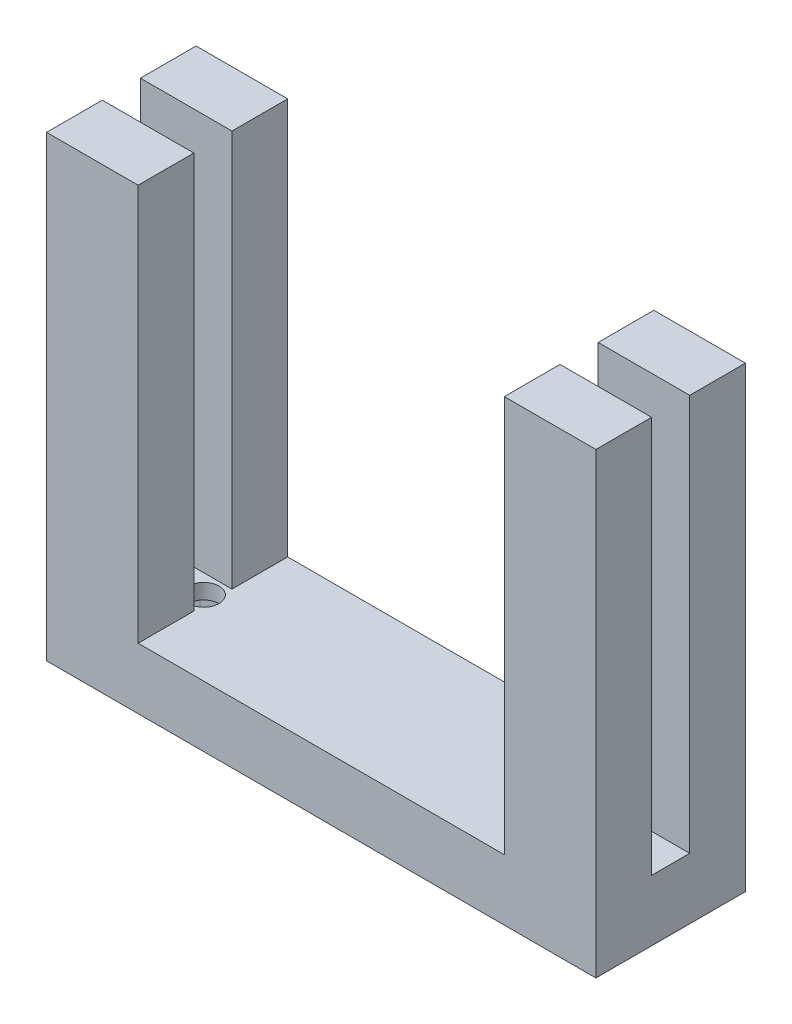
ISO-10303-21;
HEADER;
FILE_DESCRIPTION(('STEP AP214'),'2;1');
FILE_NAME('part.step','',(''),(''),'','','');
FILE_SCHEMA(('AUTOMOTIVE_DESIGN { 1 0 10303 214 1 1 1 1 }'));
ENDSEC;
DATA;
#1=APPLICATION_CONTEXT('core data for automotive mechanical design processes');
#2=APPLICATION_PROTOCOL_DEFINITION('international standard','automotive_design',2000,#1);
#3=PRODUCT_CONTEXT('',#1,'mechanical');
#4=PRODUCT('Part','Part','',(#3));
#5=PRODUCT_RELATED_PRODUCT_CATEGORY('part','',(#4));
#6=PRODUCT_DEFINITION_FORMATION('','',#4);
#7=PRODUCT_DEFINITION_CONTEXT('part definition',#1,'design');
#8=PRODUCT_DEFINITION('design','',#6,#7);
#9=PRODUCT_DEFINITION_SHAPE('','',#8);
#10=(LENGTH_UNIT() NAMED_UNIT(*) SI_UNIT(.MILLI.,.METRE.));
#11=(NAMED_UNIT(*) PLANE_ANGLE_UNIT() SI_UNIT($,.RADIAN.));
#12=(NAMED_UNIT(*) SI_UNIT($,.STERADIAN.) SOLID_ANGLE_UNIT());
#13=UNCERTAINTY_MEASURE_WITH_UNIT(LENGTH_MEASURE(1.E-05),#10,'distance_accuracy_value','');
#14=(GEOMETRIC_REPRESENTATION_CONTEXT(3) GLOBAL_UNCERTAINTY_ASSIGNED_CONTEXT((#13)) GLOBAL_UNIT_ASSIGNED_CONTEXT((#10,
#11,#12)) REPRESENTATION_CONTEXT('',''));
#15=CARTESIAN_POINT('',(0.,0.,0.));
#16=DIRECTION('',(0.,0.,1.));
#17=DIRECTION('',(1.,0.,0.));
#18=AXIS2_PLACEMENT_3D('',#15,#16,#17);
#19=CARTESIAN_POINT('',(0.,30.,0.));
#20=DIRECTION('',(0.,1.,0.));
#21=DIRECTION('',(0.,0.,1.));
#22=AXIS2_PLACEMENT_3D('',#19,#20,#21);
#23=PLANE('',#22);
#24=DIRECTION('',(0.,0.,-1.));
#25=VECTOR('',#24,1.);
#26=CARTESIAN_POINT('',(-12.,30.,4.9));
#27=LINE('',#26,#25);
#28=CARTESIAN_POINT('',(-12.,30.,-1.25));
#29=VERTEX_POINT('',#28);
#30=CARTESIAN_POINT('',(-12.,30.,-4.9));
#31=VERTEX_POINT('',#30);
#32=EDGE_CURVE('E290',#29,#31,#27,.T.);
#33=ORIENTED_EDGE('',*,*,#32,.T.);
#34=DIRECTION('',(-1.,0.,0.));
#35=VECTOR('',#34,1.);
#36=CARTESIAN_POINT('',(-18.,30.,-4.9));
#37=LINE('',#36,#35);
#38=CARTESIAN_POINT('',(-18.,30.,-4.9));
#39=VERTEX_POINT('',#38);
#40=EDGE_CURVE('E341',#31,#39,#37,.T.);
#41=ORIENTED_EDGE('',*,*,#40,.T.);
#42=DIRECTION('',(0.,0.,1.));
#43=VECTOR('',#42,1.);
#44=CARTESIAN_POINT('',(-18.,30.,-4.9));
#45=LINE('',#44,#43);
#46=CARTESIAN_POINT('',(-18.,30.,-1.25));
#47=VERTEX_POINT('',#46);
#48=EDGE_CURVE('E347',#39,#47,#45,.T.);
#49=ORIENTED_EDGE('',*,*,#48,.T.);
#50=DIRECTION('',(1.,0.,0.));
#51=VECTOR('',#50,1.);
#52=CARTESIAN_POINT('',(-18.,30.,-1.25));
#53=LINE('',#52,#51);
#54=EDGE_CURVE('E322',#47,#29,#53,.T.);
#55=ORIENTED_EDGE('',*,*,#54,.T.);
#56=EDGE_LOOP('',(#33,#41,#49,#55));
#57=FACE_BOUND('',#56,.T.);
#58=ADVANCED_FACE('F35',(#57),#23,.T.);
#59=CARTESIAN_POINT('',(-12.,30.,4.9));
#60=VERTEX_POINT('',#59);
#61=CARTESIAN_POINT('',(-12.,30.,1.25));
#62=VERTEX_POINT('',#61);
#63=EDGE_CURVE('E286',#60,#62,#27,.T.);
#64=ORIENTED_EDGE('',*,*,#63,.T.);
#65=DIRECTION('',(1.,0.,0.));
#66=VECTOR('',#65,1.);
#67=CARTESIAN_POINT('',(-18.,30.,1.25));
#68=LINE('',#67,#66);
#69=CARTESIAN_POINT('',(-18.,30.,1.25));
#70=VERTEX_POINT('',#69);
#71=EDGE_CURVE('E335',#70,#62,#68,.T.);
#72=ORIENTED_EDGE('',*,*,#71,.F.);
#73=CARTESIAN_POINT('',(-18.,30.,4.9));
#74=VERTEX_POINT('',#73);
#75=EDGE_CURVE('E346',#70,#74,#45,.T.);
#76=ORIENTED_EDGE('',*,*,#75,.T.);
#77=DIRECTION('',(1.,0.,0.));
#78=VECTOR('',#77,1.);
#79=CARTESIAN_POINT('',(-18.,30.,4.9));
#80=LINE('',#79,#78);
#81=EDGE_CURVE('E351',#74,#60,#80,.T.);
#82=ORIENTED_EDGE('',*,*,#81,.T.);
#83=EDGE_LOOP('',(#64,#72,#76,#82));
#84=FACE_BOUND('',#83,.T.);
#85=ADVANCED_FACE('F437',(#84),#23,.T.);
#86=CARTESIAN_POINT('',(-18.,30.,-1.25));
#87=DIRECTION('',(0.,0.,-1.));
#88=DIRECTION('',(0.,1.,0.));
#89=AXIS2_PLACEMENT_3D('',#86,#87,#88);
#90=PLANE('',#89);
#91=DIRECTION('',(1.,0.,0.));
#92=VECTOR('',#91,1.);
#93=CARTESIAN_POINT('',(-18.,4.,-1.25));
#94=LINE('',#93,#92);
#95=CARTESIAN_POINT('',(-18.,4.,-1.25));
#96=VERTEX_POINT('',#95);
#97=CARTESIAN_POINT('',(-12.,4.,-1.25));
#98=VERTEX_POINT('',#97);
#99=EDGE_CURVE('E327',#96,#98,#94,.T.);
#100=ORIENTED_EDGE('',*,*,#99,.T.);
#101=DIRECTION('',(0.,1.,0.));
#102=VECTOR('',#101,1.);
#103=CARTESIAN_POINT('',(-12.,30.,-1.25));
#104=LINE('',#103,#102);
#105=EDGE_CURVE('E300',#98,#29,#104,.T.);
#106=ORIENTED_EDGE('',*,*,#105,.T.);
#107=ORIENTED_EDGE('',*,*,#54,.F.);
#108=DIRECTION('',(0.,1.,0.));
#109=VECTOR('',#108,1.);
#110=CARTESIAN_POINT('',(-18.,30.,-1.25));
#111=LINE('',#110,#109);
#112=EDGE_CURVE('E311',#96,#47,#111,.T.);
#113=ORIENTED_EDGE('',*,*,#112,.F.);
#114=EDGE_LOOP('',(#100,#106,#107,#113));
#115=FACE_BOUND('',#114,.T.);
#116=ADVANCED_FACE('F425',(#115),#90,.F.);
#117=CARTESIAN_POINT('',(-18.,30.,1.25));
#118=DIRECTION('',(0.,0.,1.));
#119=DIRECTION('',(0.,-1.,0.));
#120=AXIS2_PLACEMENT_3D('',#117,#118,#119);
#121=PLANE('',#120);
#122=ORIENTED_EDGE('',*,*,#71,.T.);
#123=DIRECTION('',(0.,-1.,0.));
#124=VECTOR('',#123,1.);
#125=CARTESIAN_POINT('',(-12.,30.,1.25));
#126=LINE('',#125,#124);
#127=CARTESIAN_POINT('',(-12.,4.,1.25));
#128=VERTEX_POINT('',#127);
#129=EDGE_CURVE('E11',#62,#128,#126,.T.);
#130=ORIENTED_EDGE('',*,*,#129,.T.);
#131=DIRECTION('',(1.,0.,0.));
#132=VECTOR('',#131,1.);
#133=CARTESIAN_POINT('',(-18.,4.,1.25));
#134=LINE('',#133,#132);
#135=CARTESIAN_POINT('',(-18.,4.,1.25));
#136=VERTEX_POINT('',#135);
#137=EDGE_CURVE('E331',#136,#128,#134,.T.);
#138=ORIENTED_EDGE('',*,*,#137,.F.);
#139=DIRECTION('',(0.,-1.,0.));
#140=VECTOR('',#139,1.);
#141=CARTESIAN_POINT('',(-18.,30.,1.25));
#142=LINE('',#141,#140);
#143=EDGE_CURVE('E304',#70,#136,#142,.T.);
#144=ORIENTED_EDGE('',*,*,#143,.F.);
#145=EDGE_LOOP('',(#122,#130,#138,#144));
#146=FACE_BOUND('',#145,.T.);
#147=ADVANCED_FACE('F432',(#146),#121,.F.);
#148=DIRECTION('',(0.,0.,-1.));
#149=VECTOR('',#148,1.);
#150=CARTESIAN_POINT('',(12.,30.,4.9));
#151=LINE('',#150,#149);
#152=CARTESIAN_POINT('',(12.,30.,-1.25));
#153=VERTEX_POINT('',#152);
#154=CARTESIAN_POINT('',(12.,30.,-4.9));
#155=VERTEX_POINT('',#154);
#156=EDGE_CURVE('E280',#153,#155,#151,.T.);
#157=ORIENTED_EDGE('',*,*,#156,.F.);
#158=CARTESIAN_POINT('',(18.,30.,-1.25));
#159=VERTEX_POINT('',#158);
#160=EDGE_CURVE('E326',#153,#159,#53,.T.);
#161=ORIENTED_EDGE('',*,*,#160,.T.);
#162=DIRECTION('',(0.,0.,-1.));
#163=VECTOR('',#162,1.);
#164=CARTESIAN_POINT('',(18.,30.,-4.9));
#165=LINE('',#164,#163);
#166=CARTESIAN_POINT('',(18.,30.,-4.9));
#167=VERTEX_POINT('',#166);
#168=EDGE_CURVE('E342',#159,#167,#165,.T.);
#169=ORIENTED_EDGE('',*,*,#168,.T.);
#170=EDGE_CURVE('E343',#167,#155,#37,.T.);
#171=ORIENTED_EDGE('',*,*,#170,.T.);
#172=EDGE_LOOP('',(#157,#161,#169,#171));
#173=FACE_BOUND('',#172,.T.);
#174=ADVANCED_FACE('F414',(#173),#23,.T.);
#175=CARTESIAN_POINT('',(18.,30.,-4.9));
#176=DIRECTION('',(-1.,0.,0.));
#177=DIRECTION('',(0.,0.,1.));
#178=AXIS2_PLACEMENT_3D('',#175,#176,#177);
#179=PLANE('',#178);
#180=ORIENTED_EDGE('',*,*,#168,.F.);
#181=DIRECTION('',(0.,1.,0.));
#182=VECTOR('',#181,1.);
#183=CARTESIAN_POINT('',(18.,30.,-1.25));
#184=LINE('',#183,#182);
#185=CARTESIAN_POINT('',(18.,4.,-1.25));
#186=VERTEX_POINT('',#185);
#187=EDGE_CURVE('E308',#186,#159,#184,.T.);
#188=ORIENTED_EDGE('',*,*,#187,.F.);
#189=DIRECTION('',(0.,0.,-1.));
#190=VECTOR('',#189,1.);
#191=CARTESIAN_POINT('',(18.,4.,1.25));
#192=LINE('',#191,#190);
#193=CARTESIAN_POINT('',(18.,4.,1.25));
#194=VERTEX_POINT('',#193);
#195=EDGE_CURVE('E317',#194,#186,#192,.T.);
#196=ORIENTED_EDGE('',*,*,#195,.F.);
#197=DIRECTION('',(0.,-1.,0.));
#198=VECTOR('',#197,1.);
#199=CARTESIAN_POINT('',(18.,30.,1.25));
#200=LINE('',#199,#198);
#201=CARTESIAN_POINT('',(18.,30.,1.25));
#202=VERTEX_POINT('',#201);
#203=EDGE_CURVE('E303',#202,#194,#200,.T.);
#204=ORIENTED_EDGE('',*,*,#203,.F.);
#205=CARTESIAN_POINT('',(18.,30.,4.9));
#206=VERTEX_POINT('',#205);
#207=EDGE_CURVE('E338',#206,#202,#165,.T.);
#208=ORIENTED_EDGE('',*,*,#207,.F.);
#209=DIRECTION('',(0.,-1.,0.));
#210=VECTOR('',#209,1.);
#211=CARTESIAN_POINT('',(18.,30.,4.9));
#212=LINE('',#211,#210);
#213=CARTESIAN_POINT('',(18.,0.,4.9));
#214=VERTEX_POINT('',#213);
#215=EDGE_CURVE('E354',#206,#214,#212,.T.);
#216=ORIENTED_EDGE('',*,*,#215,.T.);
#217=DIRECTION('',(0.,0.,-1.));
#218=VECTOR('',#217,1.);
#219=CARTESIAN_POINT('',(18.,0.,-4.9));
#220=LINE('',#219,#218);
#221=CARTESIAN_POINT('',(18.,0.,-4.9));
#222=VERTEX_POINT('',#221);
#223=EDGE_CURVE('E325',#214,#222,#220,.T.);
#224=ORIENTED_EDGE('',*,*,#223,.T.);
#225=DIRECTION('',(0.,-1.,0.));
#226=VECTOR('',#225,1.);
#227=CARTESIAN_POINT('',(18.,30.,-4.9));
#228=LINE('',#227,#226);
#229=EDGE_CURVE('E371',#167,#222,#228,.T.);
#230=ORIENTED_EDGE('',*,*,#229,.F.);
#231=EDGE_LOOP('',(#180,#188,#196,#204,#208,#216,#224,#230));
#232=FACE_BOUND('',#231,.T.);
#233=ADVANCED_FACE('F37',(#232),#179,.F.);
#234=CARTESIAN_POINT('',(-18.,30.,-4.9));
#235=DIRECTION('',(0.,0.,1.));
#236=DIRECTION('',(1.,0.,0.));
#237=AXIS2_PLACEMENT_3D('',#234,#235,#236);
#238=PLANE('',#237);
#239=ORIENTED_EDGE('',*,*,#40,.F.);
#240=DIRECTION('',(0.,1.,0.));
#241=VECTOR('',#240,1.);
#242=CARTESIAN_POINT('',(-12.,30.,-4.9));
#243=LINE('',#242,#241);
#244=CARTESIAN_POINT('',(-12.,4.,-4.9));
#245=VERTEX_POINT('',#244);
#246=EDGE_CURVE('E274',#245,#31,#243,.T.);
#247=ORIENTED_EDGE('',*,*,#246,.F.);
#248=DIRECTION('',(-1.,0.,0.));
#249=VECTOR('',#248,1.);
#250=CARTESIAN_POINT('',(12.,4.,-4.9));
#251=LINE('',#250,#249);
#252=CARTESIAN_POINT('',(12.,4.,-4.9));
#253=VERTEX_POINT('',#252);
#254=EDGE_CURVE('E282',#253,#245,#251,.T.);
#255=ORIENTED_EDGE('',*,*,#254,.F.);
#256=DIRECTION('',(0.,-1.,0.));
#257=VECTOR('',#256,1.);
#258=CARTESIAN_POINT('',(12.,30.,-4.9));
#259=LINE('',#258,#257);
#260=EDGE_CURVE('E258',#155,#253,#259,.T.);
#261=ORIENTED_EDGE('',*,*,#260,.F.);
#262=ORIENTED_EDGE('',*,*,#170,.F.);
#263=ORIENTED_EDGE('',*,*,#229,.T.);
#264=DIRECTION('',(-1.,0.,0.));
#265=VECTOR('',#264,1.);
#266=CARTESIAN_POINT('',(-18.,0.,-4.9));
#267=LINE('',#266,#265);
#268=CARTESIAN_POINT('',(-18.,0.,-4.9));
#269=VERTEX_POINT('',#268);
#270=EDGE_CURVE('E357',#222,#269,#267,.T.);
#271=ORIENTED_EDGE('',*,*,#270,.T.);
#272=DIRECTION('',(0.,-1.,0.));
#273=VECTOR('',#272,1.);
#274=CARTESIAN_POINT('',(-18.,30.,-4.9));
#275=LINE('',#274,#273);
#276=EDGE_CURVE('E368',#39,#269,#275,.T.);
#277=ORIENTED_EDGE('',*,*,#276,.F.);
#278=EDGE_LOOP('',(#239,#247,#255,#261,#262,#263,#271,#277));
#279=FACE_BOUND('',#278,.T.);
#280=ADVANCED_FACE('F408',(#279),#238,.F.);
#281=CARTESIAN_POINT('',(-18.,30.,-4.9));
#282=DIRECTION('',(1.,0.,0.));
#283=DIRECTION('',(0.,0.,-1.));
#284=AXIS2_PLACEMENT_3D('',#281,#282,#283);
#285=PLANE('',#284);
#286=DIRECTION('',(0.,0.,-1.));
#287=VECTOR('',#286,1.);
#288=CARTESIAN_POINT('',(-18.,4.,1.25));
#289=LINE('',#288,#287);
#290=EDGE_CURVE('E307',#136,#96,#289,.T.);
#291=ORIENTED_EDGE('',*,*,#290,.T.);
#292=ORIENTED_EDGE('',*,*,#112,.T.);
#293=ORIENTED_EDGE('',*,*,#48,.F.);
#294=ORIENTED_EDGE('',*,*,#276,.T.);
#295=DIRECTION('',(0.,0.,1.));
#296=VECTOR('',#295,1.);
#297=CARTESIAN_POINT('',(-18.,0.,-4.9));
#298=LINE('',#297,#296);
#299=CARTESIAN_POINT('',(-18.,0.,4.9));
#300=VERTEX_POINT('',#299);
#301=EDGE_CURVE('E359',#269,#300,#298,.T.);
#302=ORIENTED_EDGE('',*,*,#301,.T.);
#303=DIRECTION('',(0.,-1.,0.));
#304=VECTOR('',#303,1.);
#305=CARTESIAN_POINT('',(-18.,30.,4.9));
#306=LINE('',#305,#304);
#307=EDGE_CURVE('E365',#74,#300,#306,.T.);
#308=ORIENTED_EDGE('',*,*,#307,.F.);
#309=ORIENTED_EDGE('',*,*,#75,.F.);
#310=ORIENTED_EDGE('',*,*,#143,.T.);
#311=EDGE_LOOP('',(#291,#292,#293,#294,#302,#308,#309,#310));
#312=FACE_BOUND('',#311,.T.);
#313=ADVANCED_FACE('F428',(#312),#285,.F.);
#314=CARTESIAN_POINT('',(-18.,30.,4.9));
#315=DIRECTION('',(0.,0.,-1.));
#316=DIRECTION('',(-1.,0.,0.));
#317=AXIS2_PLACEMENT_3D('',#314,#315,#316);
#318=PLANE('',#317);
#319=DIRECTION('',(-1.,0.,0.));
#320=VECTOR('',#319,1.);
#321=CARTESIAN_POINT('',(12.,4.,4.9));
#322=LINE('',#321,#320);
#323=CARTESIAN_POINT('',(12.,4.,4.9));
#324=VERTEX_POINT('',#323);
#325=CARTESIAN_POINT('',(-12.,4.,4.9));
#326=VERTEX_POINT('',#325);
#327=EDGE_CURVE('E273',#324,#326,#322,.T.);
#328=ORIENTED_EDGE('',*,*,#327,.T.);
#329=DIRECTION('',(0.,1.,0.));
#330=VECTOR('',#329,1.);
#331=CARTESIAN_POINT('',(-12.,30.,4.9));
#332=LINE('',#331,#330);
#333=EDGE_CURVE('E277',#326,#60,#332,.T.);
#334=ORIENTED_EDGE('',*,*,#333,.T.);
#335=ORIENTED_EDGE('',*,*,#81,.F.);
#336=ORIENTED_EDGE('',*,*,#307,.T.);
#337=DIRECTION('',(1.,0.,0.));
#338=VECTOR('',#337,1.);
#339=CARTESIAN_POINT('',(-18.,0.,4.9));
#340=LINE('',#339,#338);
#341=EDGE_CURVE('E361',#300,#214,#340,.T.);
#342=ORIENTED_EDGE('',*,*,#341,.T.);
#343=ORIENTED_EDGE('',*,*,#215,.F.);
#344=CARTESIAN_POINT('',(12.,30.,4.9));
#345=VERTEX_POINT('',#344);
#346=EDGE_CURVE('E350',#345,#206,#80,.T.);
#347=ORIENTED_EDGE('',*,*,#346,.F.);
#348=DIRECTION('',(0.,-1.,0.));
#349=VECTOR('',#348,1.);
#350=CARTESIAN_POINT('',(12.,30.,4.9));
#351=LINE('',#350,#349);
#352=EDGE_CURVE('E270',#345,#324,#351,.T.);
#353=ORIENTED_EDGE('',*,*,#352,.T.);
#354=EDGE_LOOP('',(#328,#334,#335,#336,#342,#343,#347,#353));
#355=FACE_BOUND('',#354,.T.);
#356=ADVANCED_FACE('F397',(#355),#318,.F.);
#357=CARTESIAN_POINT('',(12.,30.,1.25));
#358=VERTEX_POINT('',#357);
#359=EDGE_CURVE('E297',#345,#358,#151,.T.);
#360=ORIENTED_EDGE('',*,*,#359,.F.);
#361=ORIENTED_EDGE('',*,*,#346,.T.);
#362=ORIENTED_EDGE('',*,*,#207,.T.);
#363=EDGE_CURVE('E314',#358,#202,#68,.T.);
#364=ORIENTED_EDGE('',*,*,#363,.F.);
#365=EDGE_LOOP('',(#360,#361,#362,#364));
#366=FACE_BOUND('',#365,.T.);
#367=ADVANCED_FACE('F382',(#366),#23,.T.);
#368=CARTESIAN_POINT('',(0.,0.,0.));
#369=DIRECTION('',(0.,1.,0.));
#370=DIRECTION('',(0.,0.,1.));
#371=AXIS2_PLACEMENT_3D('',#368,#369,#370);
#372=PLANE('',#371);
#373=DIRECTION('',(-0.994815633276555,0.,0.101694915254237));
#374=VECTOR('',#373,1.);
#375=CARTESIAN_POINT('',(14.9661016949153,0.,2.11398322071268));
#376=LINE('',#375,#374);
#377=CARTESIAN_POINT('',(14.9661016949153,0.,2.11398322071268));
#378=VERTEX_POINT('',#377);
#379=CARTESIAN_POINT('',(0.368644067796609,0.,3.60620667062751));
#380=VERTEX_POINT('',#379);
#381=EDGE_CURVE('E240',#378,#380,#376,.T.);
#382=ORIENTED_EDGE('',*,*,#381,.F.);
#383=CARTESIAN_POINT('',(14.75,0.,0.));
#384=DIRECTION('',(0.,-1.,0.));
#385=DIRECTION('',(0.,0.,-1.));
#386=AXIS2_PLACEMENT_3D('',#383,#384,#385);
#387=CIRCLE('',#386,2.125);
#388=CARTESIAN_POINT('',(14.9661016949153,0.,-2.11398322071268));
#389=VERTEX_POINT('',#388);
#390=EDGE_CURVE('E50',#389,#378,#387,.T.);
#391=ORIENTED_EDGE('',*,*,#390,.F.);
#392=DIRECTION('',(0.994815633276555,0.,0.101694915254237));
#393=VECTOR('',#392,1.);
#394=CARTESIAN_POINT('',(14.9661016949153,0.,-2.11398322071268));
#395=LINE('',#394,#393);
#396=CARTESIAN_POINT('',(0.368644067796609,0.,-3.60620667062751));
#397=VERTEX_POINT('',#396);
#398=EDGE_CURVE('E217',#397,#389,#395,.T.);
#399=ORIENTED_EDGE('',*,*,#398,.F.);
#400=CARTESIAN_POINT('',(0.,0.,0.));
#401=DIRECTION('',(0.,-1.,0.));
#402=DIRECTION('',(0.,0.,-1.));
#403=AXIS2_PLACEMENT_3D('',#400,#401,#402);
#404=CIRCLE('',#403,3.625);
#405=CARTESIAN_POINT('',(-0.36864406779661,0.,-3.60620667062751));
#406=VERTEX_POINT('',#405);
#407=EDGE_CURVE('E220',#406,#397,#404,.T.);
#408=ORIENTED_EDGE('',*,*,#407,.F.);
#409=DIRECTION('',(0.994815633276555,0.,-0.101694915254237));
#410=VECTOR('',#409,1.);
#411=CARTESIAN_POINT('',(-14.9661016949153,0.,-2.11398322071268));
#412=LINE('',#411,#410);
#413=CARTESIAN_POINT('',(-14.9661016949153,0.,-2.11398322071268));
#414=VERTEX_POINT('',#413);
#415=EDGE_CURVE('E251',#414,#406,#412,.T.);
#416=ORIENTED_EDGE('',*,*,#415,.F.);
#417=CARTESIAN_POINT('',(-14.75,0.,0.));
#418=DIRECTION('',(0.,-1.,0.));
#419=DIRECTION('',(0.,0.,1.));
#420=AXIS2_PLACEMENT_3D('',#417,#418,#419);
#421=CIRCLE('',#420,2.125);
#422=CARTESIAN_POINT('',(-14.9661016949153,0.,2.11398322071268));
#423=VERTEX_POINT('',#422);
#424=EDGE_CURVE('E248',#423,#414,#421,.T.);
#425=ORIENTED_EDGE('',*,*,#424,.F.);
#426=DIRECTION('',(-0.994815633276555,0.,-0.101694915254237));
#427=VECTOR('',#426,1.);
#428=CARTESIAN_POINT('',(-0.368644067796609,0.,3.60620667062751));
#429=LINE('',#428,#427);
#430=CARTESIAN_POINT('',(-0.368644067796608,0.,3.60620667062751));
#431=VERTEX_POINT('',#430);
#432=EDGE_CURVE('E245',#431,#423,#429,.T.);
#433=ORIENTED_EDGE('',*,*,#432,.F.);
#434=CARTESIAN_POINT('',(0.,0.,0.));
#435=DIRECTION('',(0.,-1.,0.));
#436=DIRECTION('',(0.,0.,-1.));
#437=AXIS2_PLACEMENT_3D('',#434,#435,#436);
#438=CIRCLE('',#437,3.625);
#439=EDGE_CURVE('E242',#380,#431,#438,.T.);
#440=ORIENTED_EDGE('',*,*,#439,.F.);
#441=EDGE_LOOP('',(#382,#391,#399,#408,#416,#425,#433,#440));
#442=FACE_BOUND('',#441,.T.);
#443=ORIENTED_EDGE('',*,*,#223,.F.);
#444=ORIENTED_EDGE('',*,*,#341,.F.);
#445=ORIENTED_EDGE('',*,*,#301,.F.);
#446=ORIENTED_EDGE('',*,*,#270,.F.);
#447=EDGE_LOOP('',(#443,#444,#445,#446));
#448=FACE_BOUND('',#447,.T.);
#449=ADVANCED_FACE('F403',(#442,#448),#372,.F.);
#450=ORIENTED_EDGE('',*,*,#160,.F.);
#451=DIRECTION('',(0.,-1.,0.));
#452=VECTOR('',#451,1.);
#453=CARTESIAN_POINT('',(12.,30.,-1.25));
#454=LINE('',#453,#452);
#455=CARTESIAN_POINT('',(12.,4.,-1.25));
#456=VERTEX_POINT('',#455);
#457=EDGE_CURVE('E289',#153,#456,#454,.T.);
#458=ORIENTED_EDGE('',*,*,#457,.T.);
#459=EDGE_CURVE('E330',#456,#186,#94,.T.);
#460=ORIENTED_EDGE('',*,*,#459,.T.);
#461=ORIENTED_EDGE('',*,*,#187,.T.);
#462=EDGE_LOOP('',(#450,#458,#460,#461));
#463=FACE_BOUND('',#462,.T.);
#464=ADVANCED_FACE('F417',(#463),#90,.F.);
#465=CARTESIAN_POINT('',(-18.,4.,1.25));
#466=DIRECTION('',(0.,-1.,0.));
#467=DIRECTION('',(0.,0.,-1.));
#468=AXIS2_PLACEMENT_3D('',#465,#466,#467);
#469=PLANE('',#468);
#470=CARTESIAN_POINT('',(-12.6,4.,0.));
#471=DIRECTION('',(0.,-1.,0.));
#472=DIRECTION('',(0.,0.,-1.));
#473=AXIS2_PLACEMENT_3D('',#470,#471,#472);
#474=CIRCLE('',#473,1.);
#475=CARTESIAN_POINT('',(-12.6,4.,-0.999999999999999));
#476=VERTEX_POINT('',#475);
#477=EDGE_CURVE('E485',#476,#476,#474,.F.);
#478=ORIENTED_EDGE('',*,*,#477,.F.);
#479=EDGE_LOOP('',(#478));
#480=FACE_BOUND('',#479,.T.);
#481=CARTESIAN_POINT('',(12.6,4.,0.));
#482=DIRECTION('',(0.,-1.,0.));
#483=DIRECTION('',(0.,0.,-1.));
#484=AXIS2_PLACEMENT_3D('',#481,#482,#483);
#485=CIRCLE('',#484,1.);
#486=CARTESIAN_POINT('',(12.6,4.,-1.));
#487=VERTEX_POINT('',#486);
#488=EDGE_CURVE('E223',#487,#487,#485,.F.);
#489=ORIENTED_EDGE('',*,*,#488,.F.);
#490=EDGE_LOOP('',(#489));
#491=FACE_BOUND('',#490,.T.);
#492=ORIENTED_EDGE('',*,*,#459,.F.);
#493=DIRECTION('',(0.,0.,-1.));
#494=VECTOR('',#493,1.);
#495=CARTESIAN_POINT('',(12.,4.,4.9));
#496=LINE('',#495,#494);
#497=EDGE_CURVE('E58',#456,#253,#496,.T.);
#498=ORIENTED_EDGE('',*,*,#497,.T.);
#499=ORIENTED_EDGE('',*,*,#254,.T.);
#500=DIRECTION('',(0.,0.,-1.));
#501=VECTOR('',#500,1.);
#502=CARTESIAN_POINT('',(-12.,4.,4.9));
#503=LINE('',#502,#501);
#504=EDGE_CURVE('E293',#98,#245,#503,.T.);
#505=ORIENTED_EDGE('',*,*,#504,.F.);
#506=ORIENTED_EDGE('',*,*,#99,.F.);
#507=ORIENTED_EDGE('',*,*,#290,.F.);
#508=ORIENTED_EDGE('',*,*,#137,.T.);
#509=EDGE_CURVE('E291',#326,#128,#503,.T.);
#510=ORIENTED_EDGE('',*,*,#509,.F.);
#511=ORIENTED_EDGE('',*,*,#327,.F.);
#512=CARTESIAN_POINT('',(12.,4.,1.25));
#513=VERTEX_POINT('',#512);
#514=EDGE_CURVE('E294',#324,#513,#496,.T.);
#515=ORIENTED_EDGE('',*,*,#514,.T.);
#516=EDGE_CURVE('E334',#513,#194,#134,.T.);
#517=ORIENTED_EDGE('',*,*,#516,.T.);
#518=ORIENTED_EDGE('',*,*,#195,.T.);
#519=EDGE_LOOP('',(#492,#498,#499,#505,#506,#507,#508,#510,#511,#515,#517,#518));
#520=FACE_BOUND('',#519,.T.);
#521=ADVANCED_FACE('F393',(#480,#491,#520),#469,.F.);
#522=ORIENTED_EDGE('',*,*,#516,.F.);
#523=DIRECTION('',(0.,1.,0.));
#524=VECTOR('',#523,1.);
#525=CARTESIAN_POINT('',(12.,30.,1.25));
#526=LINE('',#525,#524);
#527=EDGE_CURVE('E43',#513,#358,#526,.T.);
#528=ORIENTED_EDGE('',*,*,#527,.T.);
#529=ORIENTED_EDGE('',*,*,#363,.T.);
#530=ORIENTED_EDGE('',*,*,#203,.T.);
#531=EDGE_LOOP('',(#522,#528,#529,#530));
#532=FACE_BOUND('',#531,.T.);
#533=ADVANCED_FACE('F377',(#532),#121,.F.);
#534=CARTESIAN_POINT('',(12.,30.,4.9));
#535=DIRECTION('',(1.,0.,0.));
#536=DIRECTION('',(0.,1.,0.));
#537=AXIS2_PLACEMENT_3D('',#534,#535,#536);
#538=PLANE('',#537);
#539=ORIENTED_EDGE('',*,*,#514,.F.);
#540=ORIENTED_EDGE('',*,*,#352,.F.);
#541=ORIENTED_EDGE('',*,*,#359,.T.);
#542=ORIENTED_EDGE('',*,*,#527,.F.);
#543=EDGE_LOOP('',(#539,#540,#541,#542));
#544=FACE_BOUND('',#543,.T.);
#545=ADVANCED_FACE('F395',(#544),#538,.F.);
#546=CARTESIAN_POINT('',(-12.,30.,4.9));
#547=DIRECTION('',(-1.,0.,0.));
#548=DIRECTION('',(0.,-1.,0.));
#549=AXIS2_PLACEMENT_3D('',#546,#547,#548);
#550=PLANE('',#549);
#551=ORIENTED_EDGE('',*,*,#63,.F.);
#552=ORIENTED_EDGE('',*,*,#333,.F.);
#553=ORIENTED_EDGE('',*,*,#509,.T.);
#554=ORIENTED_EDGE('',*,*,#129,.F.);
#555=EDGE_LOOP('',(#551,#552,#553,#554));
#556=FACE_BOUND('',#555,.T.);
#557=ADVANCED_FACE('F435',(#556),#550,.F.);
#558=ORIENTED_EDGE('',*,*,#504,.T.);
#559=ORIENTED_EDGE('',*,*,#246,.T.);
#560=ORIENTED_EDGE('',*,*,#32,.F.);
#561=ORIENTED_EDGE('',*,*,#105,.F.);
#562=EDGE_LOOP('',(#558,#559,#560,#561));
#563=FACE_BOUND('',#562,.T.);
#564=ADVANCED_FACE('F440',(#563),#550,.F.);
#565=ORIENTED_EDGE('',*,*,#156,.T.);
#566=ORIENTED_EDGE('',*,*,#260,.T.);
#567=ORIENTED_EDGE('',*,*,#497,.F.);
#568=ORIENTED_EDGE('',*,*,#457,.F.);
#569=EDGE_LOOP('',(#565,#566,#567,#568));
#570=FACE_BOUND('',#569,.T.);
#571=ADVANCED_FACE('F418',(#570),#538,.F.);
#572=CARTESIAN_POINT('',(14.75,3.,0.));
#573=DIRECTION('',(0.,-1.,0.));
#574=DIRECTION('',(0.,0.,-1.));
#575=AXIS2_PLACEMENT_3D('',#572,#573,#574);
#576=CYLINDRICAL_SURFACE('',#575,2.125);
#577=ORIENTED_EDGE('',*,*,#390,.T.);
#578=DIRECTION('',(0.,-1.,0.));
#579=VECTOR('',#578,1.);
#580=CARTESIAN_POINT('',(14.9661016949153,3.,2.11398322071268));
#581=LINE('',#580,#579);
#582=CARTESIAN_POINT('',(14.9661016949153,3.,2.11398322071268));
#583=VERTEX_POINT('',#582);
#584=EDGE_CURVE('E194',#583,#378,#581,.T.);
#585=ORIENTED_EDGE('',*,*,#584,.F.);
#586=CARTESIAN_POINT('',(14.75,3.,0.));
#587=DIRECTION('',(0.,-1.,0.));
#588=DIRECTION('',(0.,0.,-1.));
#589=AXIS2_PLACEMENT_3D('',#586,#587,#588);
#590=CIRCLE('',#589,2.125);
#591=CARTESIAN_POINT('',(14.9661016949153,3.,-2.11398322071268));
#592=VERTEX_POINT('',#591);
#593=EDGE_CURVE('E198',#592,#583,#590,.T.);
#594=ORIENTED_EDGE('',*,*,#593,.F.);
#595=DIRECTION('',(0.,-1.,0.));
#596=VECTOR('',#595,1.);
#597=CARTESIAN_POINT('',(14.9661016949153,3.,-2.11398322071268));
#598=LINE('',#597,#596);
#599=EDGE_CURVE('E256',#592,#389,#598,.T.);
#600=ORIENTED_EDGE('',*,*,#599,.T.);
#601=EDGE_LOOP('',(#577,#585,#594,#600));
#602=FACE_BOUND('',#601,.T.);
#603=ADVANCED_FACE('F196',(#602),#576,.F.);
#604=CARTESIAN_POINT('',(14.9661016949153,3.,-2.11398322071268));
#605=DIRECTION('',(0.101694915254237,0.,-0.994815633276555));
#606=DIRECTION('',(-0.994815633276555,0.,-0.101694915254237));
#607=AXIS2_PLACEMENT_3D('',#604,#605,#606);
#608=PLANE('',#607);
#609=ORIENTED_EDGE('',*,*,#398,.T.);
#610=ORIENTED_EDGE('',*,*,#599,.F.);
#611=DIRECTION('',(0.994815633276555,0.,0.101694915254237));
#612=VECTOR('',#611,1.);
#613=CARTESIAN_POINT('',(14.9661016949153,3.,-2.11398322071268));
#614=LINE('',#613,#612);
#615=CARTESIAN_POINT('',(0.368644067796609,3.,-3.60620667062751));
#616=VERTEX_POINT('',#615);
#617=EDGE_CURVE('E204',#616,#592,#614,.T.);
#618=ORIENTED_EDGE('',*,*,#617,.F.);
#619=DIRECTION('',(0.,-1.,0.));
#620=VECTOR('',#619,1.);
#621=CARTESIAN_POINT('',(0.368644067796609,3.,-3.60620667062751));
#622=LINE('',#621,#620);
#623=EDGE_CURVE('E259',#616,#397,#622,.T.);
#624=ORIENTED_EDGE('',*,*,#623,.T.);
#625=EDGE_LOOP('',(#609,#610,#618,#624));
#626=FACE_BOUND('',#625,.T.);
#627=ADVANCED_FACE('F515',(#626),#608,.F.);
#628=CARTESIAN_POINT('',(0.,3.,0.));
#629=DIRECTION('',(0.,-1.,0.));
#630=DIRECTION('',(0.,0.,-1.));
#631=AXIS2_PLACEMENT_3D('',#628,#629,#630);
#632=CYLINDRICAL_SURFACE('',#631,3.625);
#633=ORIENTED_EDGE('',*,*,#407,.T.);
#634=ORIENTED_EDGE('',*,*,#623,.F.);
#635=CARTESIAN_POINT('',(0.,3.,0.));
#636=DIRECTION('',(0.,-1.,0.));
#637=DIRECTION('',(0.,0.,-1.));
#638=AXIS2_PLACEMENT_3D('',#635,#636,#637);
#639=CIRCLE('',#638,3.625);
#640=CARTESIAN_POINT('',(-0.36864406779661,3.,-3.60620667062751));
#641=VERTEX_POINT('',#640);
#642=EDGE_CURVE('E236',#641,#616,#639,.T.);
#643=ORIENTED_EDGE('',*,*,#642,.F.);
#644=DIRECTION('',(0.,-1.,0.));
#645=VECTOR('',#644,1.);
#646=CARTESIAN_POINT('',(-0.36864406779661,3.,-3.60620667062751));
#647=LINE('',#646,#645);
#648=EDGE_CURVE('E261',#641,#406,#647,.T.);
#649=ORIENTED_EDGE('',*,*,#648,.T.);
#650=EDGE_LOOP('',(#633,#634,#643,#649));
#651=FACE_BOUND('',#650,.T.);
#652=ADVANCED_FACE('F518',(#651),#632,.F.);
#653=CARTESIAN_POINT('',(-14.9661016949153,3.,-2.11398322071268));
#654=DIRECTION('',(-0.101694915254237,0.,-0.994815633276555));
#655=DIRECTION('',(-0.994815633276555,0.,0.101694915254237));
#656=AXIS2_PLACEMENT_3D('',#653,#654,#655);
#657=PLANE('',#656);
#658=ORIENTED_EDGE('',*,*,#415,.T.);
#659=ORIENTED_EDGE('',*,*,#648,.F.);
#660=DIRECTION('',(0.994815633276555,0.,-0.101694915254237));
#661=VECTOR('',#660,1.);
#662=CARTESIAN_POINT('',(-14.9661016949153,3.,-2.11398322071268));
#663=LINE('',#662,#661);
#664=CARTESIAN_POINT('',(-14.9661016949153,3.,-2.11398322071268));
#665=VERTEX_POINT('',#664);
#666=EDGE_CURVE('E233',#665,#641,#663,.T.);
#667=ORIENTED_EDGE('',*,*,#666,.F.);
#668=DIRECTION('',(0.,-1.,0.));
#669=VECTOR('',#668,1.);
#670=CARTESIAN_POINT('',(-14.9661016949153,3.,-2.11398322071268));
#671=LINE('',#670,#669);
#672=EDGE_CURVE('E263',#665,#414,#671,.T.);
#673=ORIENTED_EDGE('',*,*,#672,.T.);
#674=EDGE_LOOP('',(#658,#659,#667,#673));
#675=FACE_BOUND('',#674,.T.);
#676=ADVANCED_FACE('F522',(#675),#657,.F.);
#677=CARTESIAN_POINT('',(-14.75,3.,0.));
#678=DIRECTION('',(0.,-1.,0.));
#679=DIRECTION('',(0.,0.,-1.));
#680=AXIS2_PLACEMENT_3D('',#677,#678,#679);
#681=CYLINDRICAL_SURFACE('',#680,2.125);
#682=ORIENTED_EDGE('',*,*,#424,.T.);
#683=ORIENTED_EDGE('',*,*,#672,.F.);
#684=CARTESIAN_POINT('',(-14.75,3.,0.));
#685=DIRECTION('',(0.,-1.,0.));
#686=DIRECTION('',(0.,0.,1.));
#687=AXIS2_PLACEMENT_3D('',#684,#685,#686);
#688=CIRCLE('',#687,2.125);
#689=CARTESIAN_POINT('',(-14.9661016949153,3.,2.11398322071268));
#690=VERTEX_POINT('',#689);
#691=EDGE_CURVE('E230',#690,#665,#688,.T.);
#692=ORIENTED_EDGE('',*,*,#691,.F.);
#693=DIRECTION('',(0.,-1.,0.));
#694=VECTOR('',#693,1.);
#695=CARTESIAN_POINT('',(-14.9661016949153,3.,2.11398322071268));
#696=LINE('',#695,#694);
#697=EDGE_CURVE('E265',#690,#423,#696,.T.);
#698=ORIENTED_EDGE('',*,*,#697,.T.);
#699=EDGE_LOOP('',(#682,#683,#692,#698));
#700=FACE_BOUND('',#699,.T.);
#701=ADVANCED_FACE('F526',(#700),#681,.F.);
#702=CARTESIAN_POINT('',(-0.368644067796609,3.,3.60620667062751));
#703=DIRECTION('',(-0.101694915254237,0.,0.994815633276555));
#704=DIRECTION('',(0.994815633276555,0.,0.101694915254237));
#705=AXIS2_PLACEMENT_3D('',#702,#703,#704);
#706=PLANE('',#705);
#707=ORIENTED_EDGE('',*,*,#432,.T.);
#708=ORIENTED_EDGE('',*,*,#697,.F.);
#709=DIRECTION('',(-0.994815633276555,0.,-0.101694915254237));
#710=VECTOR('',#709,1.);
#711=CARTESIAN_POINT('',(-0.368644067796609,3.,3.60620667062751));
#712=LINE('',#711,#710);
#713=CARTESIAN_POINT('',(-0.368644067796608,3.,3.60620667062751));
#714=VERTEX_POINT('',#713);
#715=EDGE_CURVE('E227',#714,#690,#712,.T.);
#716=ORIENTED_EDGE('',*,*,#715,.F.);
#717=DIRECTION('',(0.,-1.,0.));
#718=VECTOR('',#717,1.);
#719=CARTESIAN_POINT('',(-0.368644067796608,3.,3.60620667062751));
#720=LINE('',#719,#718);
#721=EDGE_CURVE('E267',#714,#431,#720,.T.);
#722=ORIENTED_EDGE('',*,*,#721,.T.);
#723=EDGE_LOOP('',(#707,#708,#716,#722));
#724=FACE_BOUND('',#723,.T.);
#725=ADVANCED_FACE('F530',(#724),#706,.F.);
#726=CARTESIAN_POINT('',(0.,3.,0.));
#727=DIRECTION('',(0.,-1.,0.));
#728=DIRECTION('',(0.,0.,-1.));
#729=AXIS2_PLACEMENT_3D('',#726,#727,#728);
#730=CYLINDRICAL_SURFACE('',#729,3.625);
#731=ORIENTED_EDGE('',*,*,#439,.T.);
#732=ORIENTED_EDGE('',*,*,#721,.F.);
#733=CARTESIAN_POINT('',(0.,3.,0.));
#734=DIRECTION('',(0.,-1.,0.));
#735=DIRECTION('',(0.,0.,-1.));
#736=AXIS2_PLACEMENT_3D('',#733,#734,#735);
#737=CIRCLE('',#736,3.625);
#738=CARTESIAN_POINT('',(0.368644067796609,3.,3.60620667062751));
#739=VERTEX_POINT('',#738);
#740=EDGE_CURVE('E212',#739,#714,#737,.T.);
#741=ORIENTED_EDGE('',*,*,#740,.F.);
#742=DIRECTION('',(0.,-1.,0.));
#743=VECTOR('',#742,1.);
#744=CARTESIAN_POINT('',(0.368644067796609,3.,3.60620667062751));
#745=LINE('',#744,#743);
#746=EDGE_CURVE('E203',#739,#380,#745,.T.);
#747=ORIENTED_EDGE('',*,*,#746,.T.);
#748=EDGE_LOOP('',(#731,#732,#741,#747));
#749=FACE_BOUND('',#748,.T.);
#750=ADVANCED_FACE('F511',(#749),#730,.F.);
#751=CARTESIAN_POINT('',(14.9661016949153,3.,2.11398322071268));
#752=DIRECTION('',(0.101694915254237,0.,0.994815633276555));
#753=DIRECTION('',(0.994815633276555,0.,-0.101694915254237));
#754=AXIS2_PLACEMENT_3D('',#751,#752,#753);
#755=PLANE('',#754);
#756=ORIENTED_EDGE('',*,*,#381,.T.);
#757=ORIENTED_EDGE('',*,*,#746,.F.);
#758=DIRECTION('',(-0.994815633276555,0.,0.101694915254237));
#759=VECTOR('',#758,1.);
#760=CARTESIAN_POINT('',(14.9661016949153,3.,2.11398322071268));
#761=LINE('',#760,#759);
#762=EDGE_CURVE('E207',#583,#739,#761,.T.);
#763=ORIENTED_EDGE('',*,*,#762,.F.);
#764=ORIENTED_EDGE('',*,*,#584,.T.);
#765=EDGE_LOOP('',(#756,#757,#763,#764));
#766=FACE_BOUND('',#765,.T.);
#767=ADVANCED_FACE('F208',(#766),#755,.F.);
#768=CARTESIAN_POINT('',(14.75,3.,0.));
#769=DIRECTION('',(0.,-1.,0.));
#770=DIRECTION('',(0.,0.,-1.));
#771=AXIS2_PLACEMENT_3D('',#768,#769,#770);
#772=PLANE('',#771);
#773=CARTESIAN_POINT('',(-12.6,3.,0.));
#774=DIRECTION('',(0.,-1.,0.));
#775=DIRECTION('',(0.,0.,1.));
#776=AXIS2_PLACEMENT_3D('',#773,#774,#775);
#777=CIRCLE('',#776,1.);
#778=CARTESIAN_POINT('',(-12.6,3.,-0.999999999999999));
#779=VERTEX_POINT('',#778);
#780=EDGE_CURVE('E493',#779,#779,#777,.T.);
#781=ORIENTED_EDGE('',*,*,#780,.F.);
#782=EDGE_LOOP('',(#781));
#783=FACE_BOUND('',#782,.T.);
#784=CARTESIAN_POINT('',(12.6,3.,0.));
#785=DIRECTION('',(0.,-1.,0.));
#786=DIRECTION('',(0.,0.,-1.));
#787=AXIS2_PLACEMENT_3D('',#784,#785,#786);
#788=CIRCLE('',#787,1.);
#789=CARTESIAN_POINT('',(12.6,3.,-1.));
#790=VERTEX_POINT('',#789);
#791=EDGE_CURVE('E489',#790,#790,#788,.T.);
#792=ORIENTED_EDGE('',*,*,#791,.F.);
#793=EDGE_LOOP('',(#792));
#794=FACE_BOUND('',#793,.T.);
#795=ORIENTED_EDGE('',*,*,#593,.T.);
#796=ORIENTED_EDGE('',*,*,#762,.T.);
#797=ORIENTED_EDGE('',*,*,#740,.T.);
#798=ORIENTED_EDGE('',*,*,#715,.T.);
#799=ORIENTED_EDGE('',*,*,#691,.T.);
#800=ORIENTED_EDGE('',*,*,#666,.T.);
#801=ORIENTED_EDGE('',*,*,#642,.T.);
#802=ORIENTED_EDGE('',*,*,#617,.T.);
#803=EDGE_LOOP('',(#795,#796,#797,#798,#799,#800,#801,#802));
#804=FACE_BOUND('',#803,.T.);
#805=ADVANCED_FACE('F214',(#783,#794,#804),#772,.T.);
#806=CARTESIAN_POINT('',(12.6,30.001,0.));
#807=DIRECTION('',(0.,-1.,0.));
#808=DIRECTION('',(0.,0.,-1.));
#809=AXIS2_PLACEMENT_3D('',#806,#807,#808);
#810=CYLINDRICAL_SURFACE('',#809,1.);
#811=CARTESIAN_POINT('',(12.6,3.,-1.));
#812=CARTESIAN_POINT('',(12.6,3.01041666666667,-1.));
#813=CARTESIAN_POINT('',(12.6,3.02083333333334,-1.));
#814=CARTESIAN_POINT('',(12.6,3.04166666666667,-1.));
#815=CARTESIAN_POINT('',(12.6,3.05208333333334,-1.));
#816=CARTESIAN_POINT('',(12.6,3.07291666666667,-1.));
#817=CARTESIAN_POINT('',(12.6,3.08333333333334,-1.));
#818=CARTESIAN_POINT('',(12.6,3.10416666666667,-1.));
#819=CARTESIAN_POINT('',(12.6,3.11458333333334,-1.));
#820=CARTESIAN_POINT('',(12.6,3.13541666666667,-1.));
#821=CARTESIAN_POINT('',(12.6,3.14583333333334,-1.));
#822=CARTESIAN_POINT('',(12.6,3.16666666666667,-1.));
#823=CARTESIAN_POINT('',(12.6,3.17708333333334,-1.));
#824=CARTESIAN_POINT('',(12.6,3.19791666666667,-1.));
#825=CARTESIAN_POINT('',(12.6,3.20833333333334,-1.));
#826=CARTESIAN_POINT('',(12.6,3.22916666666667,-1.));
#827=CARTESIAN_POINT('',(12.6,3.23958333333334,-1.));
#828=CARTESIAN_POINT('',(12.6,3.26041666666667,-1.));
#829=CARTESIAN_POINT('',(12.6,3.27083333333334,-1.));
#830=CARTESIAN_POINT('',(12.6,3.29166666666667,-1.));
#831=CARTESIAN_POINT('',(12.6,3.30208333333334,-1.));
#832=CARTESIAN_POINT('',(12.6,3.32291666666667,-1.));
#833=CARTESIAN_POINT('',(12.6,3.33333333333334,-1.));
#834=CARTESIAN_POINT('',(12.6,3.35416666666667,-1.));
#835=CARTESIAN_POINT('',(12.6,3.36458333333334,-1.));
#836=CARTESIAN_POINT('',(12.6,3.38541666666667,-1.));
#837=CARTESIAN_POINT('',(12.6,3.39583333333334,-1.));
#838=CARTESIAN_POINT('',(12.6,3.41666666666667,-1.));
#839=CARTESIAN_POINT('',(12.6,3.42708333333334,-1.));
#840=CARTESIAN_POINT('',(12.6,3.44791666666667,-1.));
#841=CARTESIAN_POINT('',(12.6,3.45833333333334,-1.));
#842=CARTESIAN_POINT('',(12.6,3.47916666666667,-1.));
#843=CARTESIAN_POINT('',(12.6,3.48958333333334,-1.));
#844=CARTESIAN_POINT('',(12.6,3.51041666666667,-1.));
#845=CARTESIAN_POINT('',(12.6,3.52083333333334,-1.));
#846=CARTESIAN_POINT('',(12.6,3.54166666666667,-1.));
#847=CARTESIAN_POINT('',(12.6,3.55208333333334,-1.));
#848=CARTESIAN_POINT('',(12.6,3.57291666666667,-1.));
#849=CARTESIAN_POINT('',(12.6,3.58333333333334,-1.));
#850=CARTESIAN_POINT('',(12.6,3.60416666666667,-1.));
#851=CARTESIAN_POINT('',(12.6,3.61458333333334,-1.));
#852=CARTESIAN_POINT('',(12.6,3.63541666666667,-1.));
#853=CARTESIAN_POINT('',(12.6,3.64583333333334,-1.));
#854=CARTESIAN_POINT('',(12.6,3.66666666666667,-1.));
#855=CARTESIAN_POINT('',(12.6,3.67708333333334,-1.));
#856=CARTESIAN_POINT('',(12.6,3.69791666666667,-1.));
#857=CARTESIAN_POINT('',(12.6,3.70833333333334,-1.));
#858=CARTESIAN_POINT('',(12.6,3.72916666666667,-1.));
#859=CARTESIAN_POINT('',(12.6,3.73958333333334,-1.));
#860=CARTESIAN_POINT('',(12.6,3.76041666666667,-1.));
#861=CARTESIAN_POINT('',(12.6,3.77083333333334,-1.));
#862=CARTESIAN_POINT('',(12.6,3.79166666666667,-1.));
#863=CARTESIAN_POINT('',(12.6,3.80208333333334,-1.));
#864=CARTESIAN_POINT('',(12.6,3.82291666666667,-1.));
#865=CARTESIAN_POINT('',(12.6,3.83333333333334,-1.));
#866=CARTESIAN_POINT('',(12.6,3.85416666666667,-1.));
#867=CARTESIAN_POINT('',(12.6,3.86458333333334,-1.));
#868=CARTESIAN_POINT('',(12.6,3.88541666666667,-1.));
#869=CARTESIAN_POINT('',(12.6,3.89583333333334,-1.));
#870=CARTESIAN_POINT('',(12.6,3.91666666666667,-1.));
#871=CARTESIAN_POINT('',(12.6,3.92708333333334,-1.));
#872=CARTESIAN_POINT('',(12.6,3.94791666666667,-1.));
#873=CARTESIAN_POINT('',(12.6,3.95833333333334,-1.));
#874=CARTESIAN_POINT('',(12.6,3.97916666666667,-1.));
#875=CARTESIAN_POINT('',(12.6,3.98958333333334,-1.));
#876=CARTESIAN_POINT('',(12.6,4.,-1.));
#877=B_SPLINE_CURVE_WITH_KNOTS('',3,(#811,#812,#813,#814,#815,#816,#817,#818,#819,#820,#821,
#822,#823,#824,#825,#826,#827,#828,#829,#830,#831,#832,#833,#834,#835,#836,#837,#838,#839,#840,
#841,#842,#843,#844,#845,#846,#847,#848,#849,#850,#851,#852,#853,#854,#855,#856,#857,#858,#859,
#860,#861,#862,#863,#864,#865,#866,#867,#868,#869,#870,#871,#872,#873,#874,#875,#876),
.UNSPECIFIED.,.F.,.F.,(4,2,2,2,2,2,2,2,2,2,2,2,2,2,2,2,2,2,2,2,2,2,2,2,2,2,2,2,2,2,2,2,4),(0.,
0.03125,0.0625000000000001,0.0937500000000001,0.125,0.15625,0.1875,0.21875,0.25,0.28125,0.3125,
0.34375,0.375,0.40625,0.4375,0.46875,0.5,0.53125,0.5625,0.593750000000001,0.625000000000001,
0.656250000000001,0.687500000000001,0.718750000000001,0.750000000000001,0.781250000000001,
0.812500000000001,0.843750000000001,0.875000000000001,0.906250000000001,0.937500000000001,
0.968750000000001,1.),.UNSPECIFIED.);
#878=EDGE_CURVE('BSEAM504',#790,#487,#877,.T.);
#879=ORIENTED_EDGE('',*,*,#791,.T.);
#880=ORIENTED_EDGE('',*,*,#488,.T.);
#881=ORIENTED_EDGE('',*,*,#878,.T.);
#882=ORIENTED_EDGE('',*,*,#878,.F.);
#883=EDGE_LOOP('',(#879,#881,#880,#882));
#884=FACE_BOUND('',#883,.T.);
#885=ADVANCED_FACE('F504',(#884),#810,.F.);
#886=CARTESIAN_POINT('',(-12.6,30.001,0.));
#887=DIRECTION('',(0.,-1.,0.));
#888=DIRECTION('',(0.,0.,-1.));
#889=AXIS2_PLACEMENT_3D('',#886,#887,#888);
#890=CYLINDRICAL_SURFACE('',#889,1.);
#891=CARTESIAN_POINT('',(-12.6,3.,-0.999999999999999));
#892=CARTESIAN_POINT('',(-12.6,3.01041666666667,-0.999999999999999));
#893=CARTESIAN_POINT('',(-12.6,3.02083333333334,-0.999999999999999));
#894=CARTESIAN_POINT('',(-12.6,3.04166666666667,-0.999999999999999));
#895=CARTESIAN_POINT('',(-12.6,3.05208333333334,-0.999999999999999));
#896=CARTESIAN_POINT('',(-12.6,3.07291666666667,-0.999999999999999));
#897=CARTESIAN_POINT('',(-12.6,3.08333333333334,-0.999999999999999));
#898=CARTESIAN_POINT('',(-12.6,3.10416666666667,-0.999999999999999));
#899=CARTESIAN_POINT('',(-12.6,3.11458333333334,-0.999999999999999));
#900=CARTESIAN_POINT('',(-12.6,3.13541666666667,-0.999999999999999));
#901=CARTESIAN_POINT('',(-12.6,3.14583333333334,-0.999999999999999));
#902=CARTESIAN_POINT('',(-12.6,3.16666666666667,-0.999999999999999));
#903=CARTESIAN_POINT('',(-12.6,3.17708333333334,-0.999999999999999));
#904=CARTESIAN_POINT('',(-12.6,3.19791666666667,-0.999999999999999));
#905=CARTESIAN_POINT('',(-12.6,3.20833333333334,-0.999999999999999));
#906=CARTESIAN_POINT('',(-12.6,3.22916666666667,-0.999999999999999));
#907=CARTESIAN_POINT('',(-12.6,3.23958333333334,-0.999999999999999));
#908=CARTESIAN_POINT('',(-12.6,3.26041666666667,-0.999999999999999));
#909=CARTESIAN_POINT('',(-12.6,3.27083333333334,-0.999999999999999));
#910=CARTESIAN_POINT('',(-12.6,3.29166666666667,-0.999999999999999));
#911=CARTESIAN_POINT('',(-12.6,3.30208333333334,-0.999999999999999));
#912=CARTESIAN_POINT('',(-12.6,3.32291666666667,-0.999999999999999));
#913=CARTESIAN_POINT('',(-12.6,3.33333333333334,-0.999999999999999));
#914=CARTESIAN_POINT('',(-12.6,3.35416666666667,-0.999999999999999));
#915=CARTESIAN_POINT('',(-12.6,3.36458333333334,-0.999999999999999));
#916=CARTESIAN_POINT('',(-12.6,3.38541666666667,-0.999999999999999));
#917=CARTESIAN_POINT('',(-12.6,3.39583333333334,-0.999999999999999));
#918=CARTESIAN_POINT('',(-12.6,3.41666666666667,-0.999999999999999));
#919=CARTESIAN_POINT('',(-12.6,3.42708333333334,-0.999999999999999));
#920=CARTESIAN_POINT('',(-12.6,3.44791666666667,-0.999999999999999));
#921=CARTESIAN_POINT('',(-12.6,3.45833333333334,-0.999999999999999));
#922=CARTESIAN_POINT('',(-12.6,3.47916666666667,-0.999999999999999));
#923=CARTESIAN_POINT('',(-12.6,3.48958333333334,-0.999999999999999));
#924=CARTESIAN_POINT('',(-12.6,3.51041666666667,-0.999999999999999));
#925=CARTESIAN_POINT('',(-12.6,3.52083333333334,-0.999999999999999));
#926=CARTESIAN_POINT('',(-12.6,3.54166666666667,-0.999999999999999));
#927=CARTESIAN_POINT('',(-12.6,3.55208333333334,-0.999999999999999));
#928=CARTESIAN_POINT('',(-12.6,3.57291666666667,-0.999999999999999));
#929=CARTESIAN_POINT('',(-12.6,3.58333333333334,-0.999999999999999));
#930=CARTESIAN_POINT('',(-12.6,3.60416666666667,-0.999999999999999));
#931=CARTESIAN_POINT('',(-12.6,3.61458333333334,-0.999999999999999));
#932=CARTESIAN_POINT('',(-12.6,3.63541666666667,-0.999999999999999));
#933=CARTESIAN_POINT('',(-12.6,3.64583333333334,-0.999999999999999));
#934=CARTESIAN_POINT('',(-12.6,3.66666666666667,-0.999999999999999));
#935=CARTESIAN_POINT('',(-12.6,3.67708333333334,-0.999999999999999));
#936=CARTESIAN_POINT('',(-12.6,3.69791666666667,-0.999999999999999));
#937=CARTESIAN_POINT('',(-12.6,3.70833333333334,-0.999999999999999));
#938=CARTESIAN_POINT('',(-12.6,3.72916666666667,-0.999999999999999));
#939=CARTESIAN_POINT('',(-12.6,3.73958333333334,-0.999999999999999));
#940=CARTESIAN_POINT('',(-12.6,3.76041666666667,-0.999999999999999));
#941=CARTESIAN_POINT('',(-12.6,3.77083333333334,-0.999999999999999));
#942=CARTESIAN_POINT('',(-12.6,3.79166666666667,-0.999999999999999));
#943=CARTESIAN_POINT('',(-12.6,3.80208333333334,-0.999999999999999));
#944=CARTESIAN_POINT('',(-12.6,3.82291666666667,-0.999999999999999));
#945=CARTESIAN_POINT('',(-12.6,3.83333333333334,-0.999999999999999));
#946=CARTESIAN_POINT('',(-12.6,3.85416666666667,-0.999999999999999));
#947=CARTESIAN_POINT('',(-12.6,3.86458333333334,-0.999999999999999));
#948=CARTESIAN_POINT('',(-12.6,3.88541666666667,-0.999999999999999));
#949=CARTESIAN_POINT('',(-12.6,3.89583333333334,-0.999999999999999));
#950=CARTESIAN_POINT('',(-12.6,3.91666666666667,-0.999999999999999));
#951=CARTESIAN_POINT('',(-12.6,3.92708333333334,-0.999999999999999));
#952=CARTESIAN_POINT('',(-12.6,3.94791666666667,-0.999999999999999));
#953=CARTESIAN_POINT('',(-12.6,3.95833333333334,-0.999999999999999));
#954=CARTESIAN_POINT('',(-12.6,3.97916666666667,-0.999999999999999));
#955=CARTESIAN_POINT('',(-12.6,3.98958333333334,-0.999999999999999));
#956=CARTESIAN_POINT('',(-12.6,4.,-0.999999999999999));
#957=B_SPLINE_CURVE_WITH_KNOTS('',3,(#891,#892,#893,#894,#895,#896,#897,#898,#899,#900,#901,
#902,#903,#904,#905,#906,#907,#908,#909,#910,#911,#912,#913,#914,#915,#916,#917,#918,#919,#920,
#921,#922,#923,#924,#925,#926,#927,#928,#929,#930,#931,#932,#933,#934,#935,#936,#937,#938,#939,
#940,#941,#942,#943,#944,#945,#946,#947,#948,#949,#950,#951,#952,#953,#954,#955,#956),
.UNSPECIFIED.,.F.,.F.,(4,2,2,2,2,2,2,2,2,2,2,2,2,2,2,2,2,2,2,2,2,2,2,2,2,2,2,2,2,2,2,2,4),(0.,
0.03125,0.0625000000000001,0.0937500000000001,0.125,0.15625,0.1875,0.21875,0.25,0.28125,0.3125,
0.34375,0.375,0.40625,0.4375,0.46875,0.5,0.53125,0.5625,0.593750000000001,0.625000000000001,
0.656250000000001,0.687500000000001,0.718750000000001,0.750000000000001,0.781250000000001,
0.812500000000001,0.843750000000001,0.875000000000001,0.906250000000001,0.937500000000001,
0.968750000000001,1.),.UNSPECIFIED.);
#958=EDGE_CURVE('BSEAM499',#779,#476,#957,.T.);
#959=ORIENTED_EDGE('',*,*,#780,.T.);
#960=ORIENTED_EDGE('',*,*,#477,.T.);
#961=ORIENTED_EDGE('',*,*,#958,.T.);
#962=ORIENTED_EDGE('',*,*,#958,.F.);
#963=EDGE_LOOP('',(#959,#961,#960,#962));
#964=FACE_BOUND('',#963,.T.);
#965=ADVANCED_FACE('F499',(#964),#890,.F.);
#966=CLOSED_SHELL('',(#58,#85,#116,#147,#174,#233,#280,#313,#356,#367,#449,#464,#521,#533,#545,
#557,#564,#571,#603,#627,#652,#676,#701,#725,#750,#767,#805,#885,#965));
#967=MANIFOLD_SOLID_BREP('B2',#966);
#968=ADVANCED_BREP_SHAPE_REPRESENTATION('',(#18,#967),#14);
#969=SHAPE_DEFINITION_REPRESENTATION(#9,#968);
ENDSEC;
END-ISO-10303-21;
